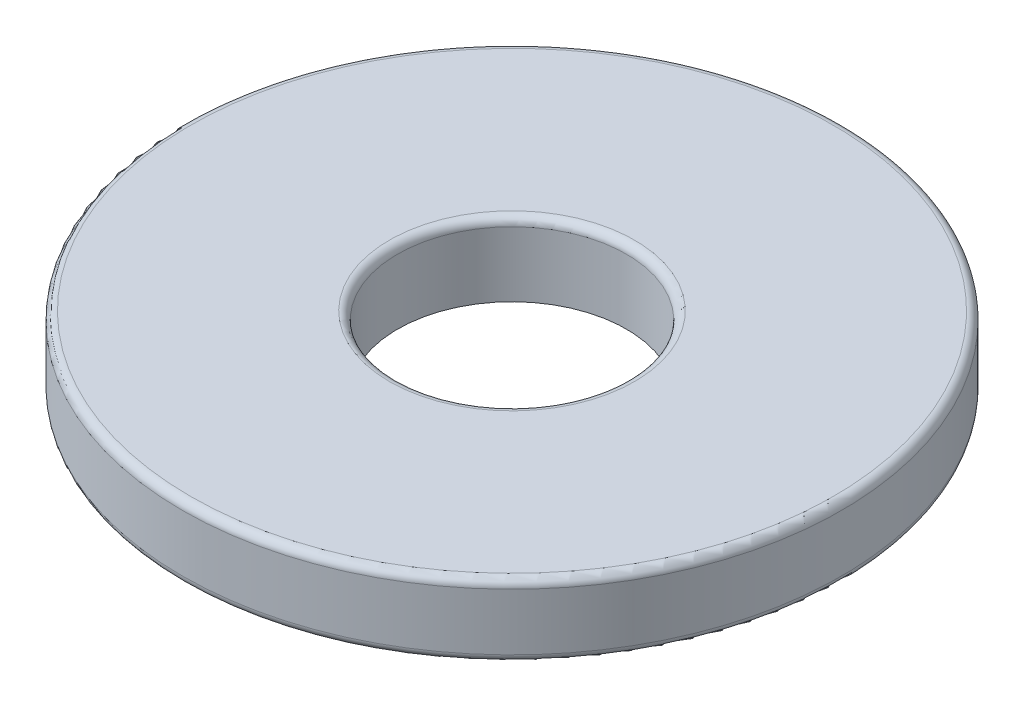
ISO-10303-21;
HEADER;
FILE_DESCRIPTION(('STEP AP214'),'2;1');
FILE_NAME('part.step','',(''),(''),'','','');
FILE_SCHEMA(('AUTOMOTIVE_DESIGN { 1 0 10303 214 1 1 1 1 }'));
ENDSEC;
DATA;
#1=APPLICATION_CONTEXT('core data for automotive mechanical design processes');
#2=APPLICATION_PROTOCOL_DEFINITION('international standard','automotive_design',2000,#1);
#3=PRODUCT_CONTEXT('',#1,'mechanical');
#4=PRODUCT('Part','Part','',(#3));
#5=PRODUCT_RELATED_PRODUCT_CATEGORY('part','',(#4));
#6=PRODUCT_DEFINITION_FORMATION('','',#4);
#7=PRODUCT_DEFINITION_CONTEXT('part definition',#1,'design');
#8=PRODUCT_DEFINITION('design','',#6,#7);
#9=PRODUCT_DEFINITION_SHAPE('','',#8);
#10=(LENGTH_UNIT() NAMED_UNIT(*) SI_UNIT(.MILLI.,.METRE.));
#11=(NAMED_UNIT(*) PLANE_ANGLE_UNIT() SI_UNIT($,.RADIAN.));
#12=(NAMED_UNIT(*) SI_UNIT($,.STERADIAN.) SOLID_ANGLE_UNIT());
#13=UNCERTAINTY_MEASURE_WITH_UNIT(LENGTH_MEASURE(1.E-05),#10,'distance_accuracy_value','');
#14=(GEOMETRIC_REPRESENTATION_CONTEXT(3) GLOBAL_UNCERTAINTY_ASSIGNED_CONTEXT((#13)) GLOBAL_UNIT_ASSIGNED_CONTEXT((#10,
#11,#12)) REPRESENTATION_CONTEXT('',''));
#15=CARTESIAN_POINT('',(0.,0.,0.));
#16=DIRECTION('',(0.,0.,1.));
#17=DIRECTION('',(1.,0.,0.));
#18=AXIS2_PLACEMENT_3D('',#15,#16,#17);
#19=CARTESIAN_POINT('',(0.,1.143,0.));
#20=DIRECTION('',(0.,1.,0.));
#21=DIRECTION('',(0.,0.,1.));
#22=AXIS2_PLACEMENT_3D('',#19,#20,#21);
#23=PLANE('',#22);
#24=CARTESIAN_POINT('',(0.,1.143,0.));
#25=DIRECTION('',(0.,1.,0.));
#26=DIRECTION('',(0.,0.,1.));
#27=AXIS2_PLACEMENT_3D('',#24,#25,#26);
#28=CIRCLE('',#27,1.9177);
#29=CARTESIAN_POINT('',(0.,1.143,1.9177));
#30=VERTEX_POINT('',#29);
#31=EDGE_CURVE('E10',#30,#30,#28,.F.);
#32=ORIENTED_EDGE('',*,*,#31,.T.);
#33=EDGE_LOOP('',(#32));
#34=FACE_BOUND('',#33,.T.);
#35=CARTESIAN_POINT('',(0.,1.143,0.));
#36=DIRECTION('',(0.,1.,0.));
#37=DIRECTION('',(0.,0.,1.));
#38=AXIS2_PLACEMENT_3D('',#35,#36,#37);
#39=CIRCLE('',#38,5.0292);
#40=CARTESIAN_POINT('',(0.,1.143,5.0292));
#41=VERTEX_POINT('',#40);
#42=EDGE_CURVE('E38',#41,#41,#39,.T.);
#43=ORIENTED_EDGE('',*,*,#42,.T.);
#44=EDGE_LOOP('',(#43));
#45=FACE_BOUND('',#44,.T.);
#46=ADVANCED_FACE('F31',(#34,#45),#23,.T.);
#47=CARTESIAN_POINT('',(0.,0.,0.));
#48=DIRECTION('',(0.,1.,0.));
#49=DIRECTION('',(0.,0.,1.));
#50=AXIS2_PLACEMENT_3D('',#47,#48,#49);
#51=PLANE('',#50);
#52=CARTESIAN_POINT('',(0.,0.,0.));
#53=DIRECTION('',(0.,1.,0.));
#54=DIRECTION('',(0.,0.,1.));
#55=AXIS2_PLACEMENT_3D('',#52,#53,#54);
#56=CIRCLE('',#55,5.0292);
#57=CARTESIAN_POINT('',(0.,0.,5.0292));
#58=VERTEX_POINT('',#57);
#59=EDGE_CURVE('E46',#58,#58,#56,.F.);
#60=ORIENTED_EDGE('',*,*,#59,.T.);
#61=EDGE_LOOP('',(#60));
#62=FACE_BOUND('',#61,.T.);
#63=CARTESIAN_POINT('',(0.,0.,0.));
#64=DIRECTION('',(0.,1.,0.));
#65=DIRECTION('',(0.,0.,1.));
#66=AXIS2_PLACEMENT_3D('',#63,#64,#65);
#67=CIRCLE('',#66,1.7907);
#68=CARTESIAN_POINT('',(0.,0.,1.7907));
#69=VERTEX_POINT('',#68);
#70=EDGE_CURVE('E57',#69,#69,#67,.T.);
#71=ORIENTED_EDGE('',*,*,#70,.T.);
#72=EDGE_LOOP('',(#71));
#73=FACE_BOUND('',#72,.T.);
#74=ADVANCED_FACE('F61',(#62,#73),#51,.F.);
#75=CARTESIAN_POINT('',(0.,1.143,0.));
#76=DIRECTION('',(0.,-1.,0.));
#77=DIRECTION('',(0.,0.,-1.));
#78=AXIS2_PLACEMENT_3D('',#75,#76,#77);
#79=CYLINDRICAL_SURFACE('',#78,5.1562);
#80=CARTESIAN_POINT('',(0.,0.127,0.));
#81=DIRECTION('',(0.,1.,0.));
#82=DIRECTION('',(0.,0.,1.));
#83=AXIS2_PLACEMENT_3D('',#80,#81,#82);
#84=CIRCLE('',#83,5.1562);
#85=CARTESIAN_POINT('',(0.,0.127,5.1562));
#86=VERTEX_POINT('',#85);
#87=EDGE_CURVE('E51',#86,#86,#84,.T.);
#88=ORIENTED_EDGE('',*,*,#87,.T.);
#89=EDGE_LOOP('',(#88));
#90=FACE_BOUND('',#89,.T.);
#91=CARTESIAN_POINT('',(0.,1.016,0.));
#92=DIRECTION('',(0.,1.,0.));
#93=DIRECTION('',(0.,0.,1.));
#94=AXIS2_PLACEMENT_3D('',#91,#92,#93);
#95=CIRCLE('',#94,5.1562);
#96=CARTESIAN_POINT('',(0.,1.016,5.1562));
#97=VERTEX_POINT('',#96);
#98=EDGE_CURVE('E54',#97,#97,#95,.F.);
#99=ORIENTED_EDGE('',*,*,#98,.T.);
#100=EDGE_LOOP('',(#99));
#101=FACE_BOUND('',#100,.T.);
#102=ADVANCED_FACE('F66',(#90,#101),#79,.T.);
#103=CARTESIAN_POINT('',(0.,1.143,0.));
#104=DIRECTION('',(0.,-1.,0.));
#105=DIRECTION('',(0.,0.,-1.));
#106=AXIS2_PLACEMENT_3D('',#103,#104,#105);
#107=CYLINDRICAL_SURFACE('',#106,1.7907);
#108=CARTESIAN_POINT('',(0.,1.016,0.));
#109=DIRECTION('',(0.,1.,0.));
#110=DIRECTION('',(0.,0.,1.));
#111=AXIS2_PLACEMENT_3D('',#108,#109,#110);
#112=CIRCLE('',#111,1.7907);
#113=CARTESIAN_POINT('',(0.,1.016,1.7907));
#114=VERTEX_POINT('',#113);
#115=EDGE_CURVE('E42',#114,#114,#112,.T.);
#116=ORIENTED_EDGE('',*,*,#115,.T.);
#117=EDGE_LOOP('',(#116));
#118=FACE_BOUND('',#117,.T.);
#119=ORIENTED_EDGE('',*,*,#70,.F.);
#120=EDGE_LOOP('',(#119));
#121=FACE_BOUND('',#120,.T.);
#122=ADVANCED_FACE('F63',(#118,#121),#107,.F.);
#123=CARTESIAN_POINT('',(0.,0.127,0.));
#124=DIRECTION('',(0.,1.,0.));
#125=DIRECTION('',(0.,0.,1.));
#126=AXIS2_PLACEMENT_3D('',#123,#124,#125);
#127=TOROIDAL_SURFACE('',#126,5.0292,0.127);
#128=ORIENTED_EDGE('',*,*,#59,.F.);
#129=EDGE_LOOP('',(#128));
#130=FACE_BOUND('',#129,.T.);
#131=ORIENTED_EDGE('',*,*,#87,.F.);
#132=EDGE_LOOP('',(#131));
#133=FACE_BOUND('',#132,.T.);
#134=ADVANCED_FACE('F65',(#130,#133),#127,.T.);
#135=CARTESIAN_POINT('',(0.,1.016,0.));
#136=DIRECTION('',(0.,1.,0.));
#137=DIRECTION('',(0.,0.,1.));
#138=AXIS2_PLACEMENT_3D('',#135,#136,#137);
#139=TOROIDAL_SURFACE('',#138,1.9177,0.127);
#140=ORIENTED_EDGE('',*,*,#31,.F.);
#141=EDGE_LOOP('',(#140));
#142=FACE_BOUND('',#141,.T.);
#143=ORIENTED_EDGE('',*,*,#115,.F.);
#144=EDGE_LOOP('',(#143));
#145=FACE_BOUND('',#144,.T.);
#146=ADVANCED_FACE('F73',(#142,#145),#139,.T.);
#147=CARTESIAN_POINT('',(0.,1.016,0.));
#148=DIRECTION('',(0.,1.,0.));
#149=DIRECTION('',(0.,0.,1.));
#150=AXIS2_PLACEMENT_3D('',#147,#148,#149);
#151=TOROIDAL_SURFACE('',#150,5.0292,0.127);
#152=ORIENTED_EDGE('',*,*,#98,.F.);
#153=EDGE_LOOP('',(#152));
#154=FACE_BOUND('',#153,.T.);
#155=ORIENTED_EDGE('',*,*,#42,.F.);
#156=EDGE_LOOP('',(#155));
#157=FACE_BOUND('',#156,.T.);
#158=ADVANCED_FACE('F33',(#154,#157),#151,.T.);
#159=CLOSED_SHELL('',(#46,#74,#102,#122,#134,#146,#158));
#160=MANIFOLD_SOLID_BREP('B2',#159);
#161=ADVANCED_BREP_SHAPE_REPRESENTATION('',(#18,#160),#14);
#162=SHAPE_DEFINITION_REPRESENTATION(#9,#161);
ENDSEC;
END-ISO-10303-21;
